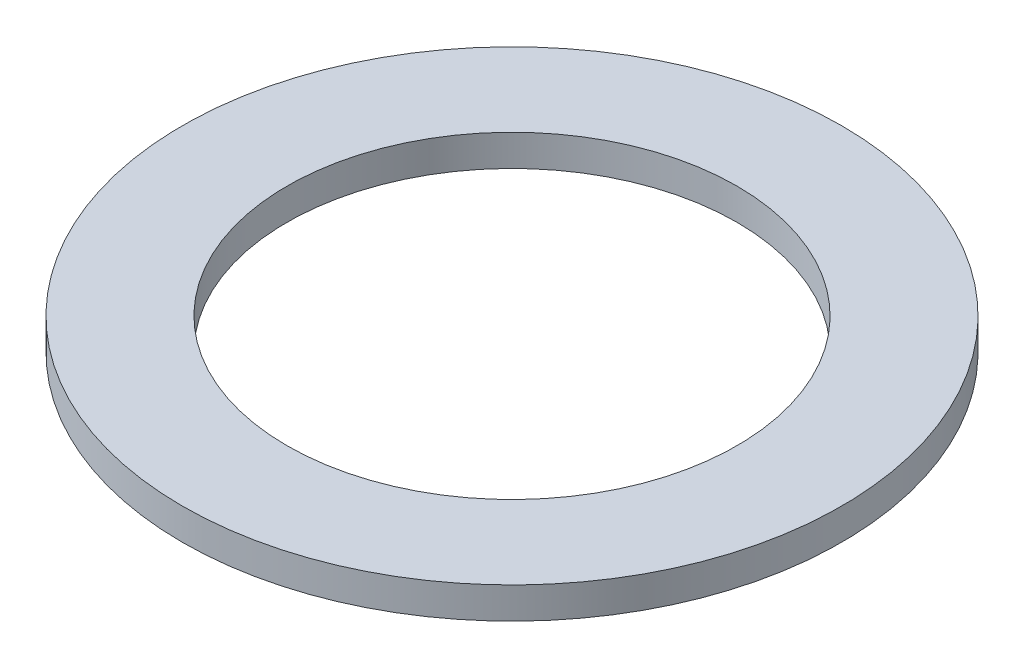
ISO-10303-21;
HEADER;
FILE_DESCRIPTION(('STEP AP214'),'2;1');
FILE_NAME('part.step','',(''),(''),'','','');
FILE_SCHEMA(('AUTOMOTIVE_DESIGN { 1 0 10303 214 1 1 1 1 }'));
ENDSEC;
DATA;
#1=APPLICATION_CONTEXT('core data for automotive mechanical design processes');
#2=APPLICATION_PROTOCOL_DEFINITION('international standard','automotive_design',2000,#1);
#3=PRODUCT_CONTEXT('',#1,'mechanical');
#4=PRODUCT('Part','Part','',(#3));
#5=PRODUCT_RELATED_PRODUCT_CATEGORY('part','',(#4));
#6=PRODUCT_DEFINITION_FORMATION('','',#4);
#7=PRODUCT_DEFINITION_CONTEXT('part definition',#1,'design');
#8=PRODUCT_DEFINITION('design','',#6,#7);
#9=PRODUCT_DEFINITION_SHAPE('','',#8);
#10=(LENGTH_UNIT() NAMED_UNIT(*) SI_UNIT(.MILLI.,.METRE.));
#11=(NAMED_UNIT(*) PLANE_ANGLE_UNIT() SI_UNIT($,.RADIAN.));
#12=(NAMED_UNIT(*) SI_UNIT($,.STERADIAN.) SOLID_ANGLE_UNIT());
#13=UNCERTAINTY_MEASURE_WITH_UNIT(LENGTH_MEASURE(1.E-05),#10,'distance_accuracy_value','');
#14=(GEOMETRIC_REPRESENTATION_CONTEXT(3) GLOBAL_UNCERTAINTY_ASSIGNED_CONTEXT((#13)) GLOBAL_UNIT_ASSIGNED_CONTEXT((#10,
#11,#12)) REPRESENTATION_CONTEXT('',''));
#15=CARTESIAN_POINT('',(0.,0.,0.));
#16=DIRECTION('',(0.,0.,1.));
#17=DIRECTION('',(1.,0.,0.));
#18=AXIS2_PLACEMENT_3D('',#15,#16,#17);
#19=CARTESIAN_POINT('',(0.,3.,0.));
#20=DIRECTION('',(0.,-1.,0.));
#21=DIRECTION('',(0.,0.,-1.));
#22=AXIS2_PLACEMENT_3D('',#19,#20,#21);
#23=CYLINDRICAL_SURFACE('',#22,21.5);
#24=CARTESIAN_POINT('',(0.,3.,0.));
#25=DIRECTION('',(0.,1.,0.));
#26=DIRECTION('',(0.,0.,1.));
#27=AXIS2_PLACEMENT_3D('',#24,#25,#26);
#28=CIRCLE('',#27,21.5);
#29=CARTESIAN_POINT('',(0.,3.,21.5));
#30=VERTEX_POINT('',#29);
#31=EDGE_CURVE('E40',#30,#30,#28,.T.);
#32=ORIENTED_EDGE('',*,*,#31,.T.);
#33=EDGE_LOOP('',(#32));
#34=FACE_BOUND('',#33,.T.);
#35=CARTESIAN_POINT('',(0.,0.,0.));
#36=DIRECTION('',(0.,1.,0.));
#37=DIRECTION('',(0.,0.,1.));
#38=AXIS2_PLACEMENT_3D('',#35,#36,#37);
#39=CIRCLE('',#38,21.5);
#40=CARTESIAN_POINT('',(0.,0.,21.5));
#41=VERTEX_POINT('',#40);
#42=EDGE_CURVE('E46',#41,#41,#39,.T.);
#43=ORIENTED_EDGE('',*,*,#42,.F.);
#44=EDGE_LOOP('',(#43));
#45=FACE_BOUND('',#44,.T.);
#46=ADVANCED_FACE('F33',(#34,#45),#23,.F.);
#47=CARTESIAN_POINT('',(0.,3.,0.));
#48=DIRECTION('',(0.,-1.,0.));
#49=DIRECTION('',(0.,0.,-1.));
#50=AXIS2_PLACEMENT_3D('',#47,#48,#49);
#51=CYLINDRICAL_SURFACE('',#50,31.5);
#52=CARTESIAN_POINT('',(0.,3.,0.));
#53=DIRECTION('',(0.,1.,0.));
#54=DIRECTION('',(0.,0.,1.));
#55=AXIS2_PLACEMENT_3D('',#52,#53,#54);
#56=CIRCLE('',#55,31.5);
#57=CARTESIAN_POINT('',(0.,3.,31.5));
#58=VERTEX_POINT('',#57);
#59=EDGE_CURVE('E10',#58,#58,#56,.T.);
#60=ORIENTED_EDGE('',*,*,#59,.F.);
#61=EDGE_LOOP('',(#60));
#62=FACE_BOUND('',#61,.T.);
#63=CARTESIAN_POINT('',(0.,0.,0.));
#64=DIRECTION('',(0.,1.,0.));
#65=DIRECTION('',(0.,0.,1.));
#66=AXIS2_PLACEMENT_3D('',#63,#64,#65);
#67=CIRCLE('',#66,31.5);
#68=CARTESIAN_POINT('',(0.,0.,31.5));
#69=VERTEX_POINT('',#68);
#70=EDGE_CURVE('E36',#69,#69,#67,.T.);
#71=ORIENTED_EDGE('',*,*,#70,.T.);
#72=EDGE_LOOP('',(#71));
#73=FACE_BOUND('',#72,.T.);
#74=ADVANCED_FACE('F53',(#62,#73),#51,.T.);
#75=CARTESIAN_POINT('',(0.,3.,0.));
#76=DIRECTION('',(0.,1.,0.));
#77=DIRECTION('',(0.,0.,1.));
#78=AXIS2_PLACEMENT_3D('',#75,#76,#77);
#79=PLANE('',#78);
#80=ORIENTED_EDGE('',*,*,#31,.F.);
#81=EDGE_LOOP('',(#80));
#82=FACE_BOUND('',#81,.T.);
#83=ORIENTED_EDGE('',*,*,#59,.T.);
#84=EDGE_LOOP('',(#83));
#85=FACE_BOUND('',#84,.T.);
#86=ADVANCED_FACE('F57',(#82,#85),#79,.T.);
#87=CARTESIAN_POINT('',(0.,0.,0.));
#88=DIRECTION('',(0.,1.,0.));
#89=DIRECTION('',(0.,0.,1.));
#90=AXIS2_PLACEMENT_3D('',#87,#88,#89);
#91=PLANE('',#90);
#92=ORIENTED_EDGE('',*,*,#42,.T.);
#93=EDGE_LOOP('',(#92));
#94=FACE_BOUND('',#93,.T.);
#95=ORIENTED_EDGE('',*,*,#70,.F.);
#96=EDGE_LOOP('',(#95));
#97=FACE_BOUND('',#96,.T.);
#98=ADVANCED_FACE('F55',(#94,#97),#91,.F.);
#99=CLOSED_SHELL('',(#46,#74,#86,#98));
#100=MANIFOLD_SOLID_BREP('B2',#99);
#101=ADVANCED_BREP_SHAPE_REPRESENTATION('',(#18,#100),#14);
#102=SHAPE_DEFINITION_REPRESENTATION(#9,#101);
ENDSEC;
END-ISO-10303-21;
